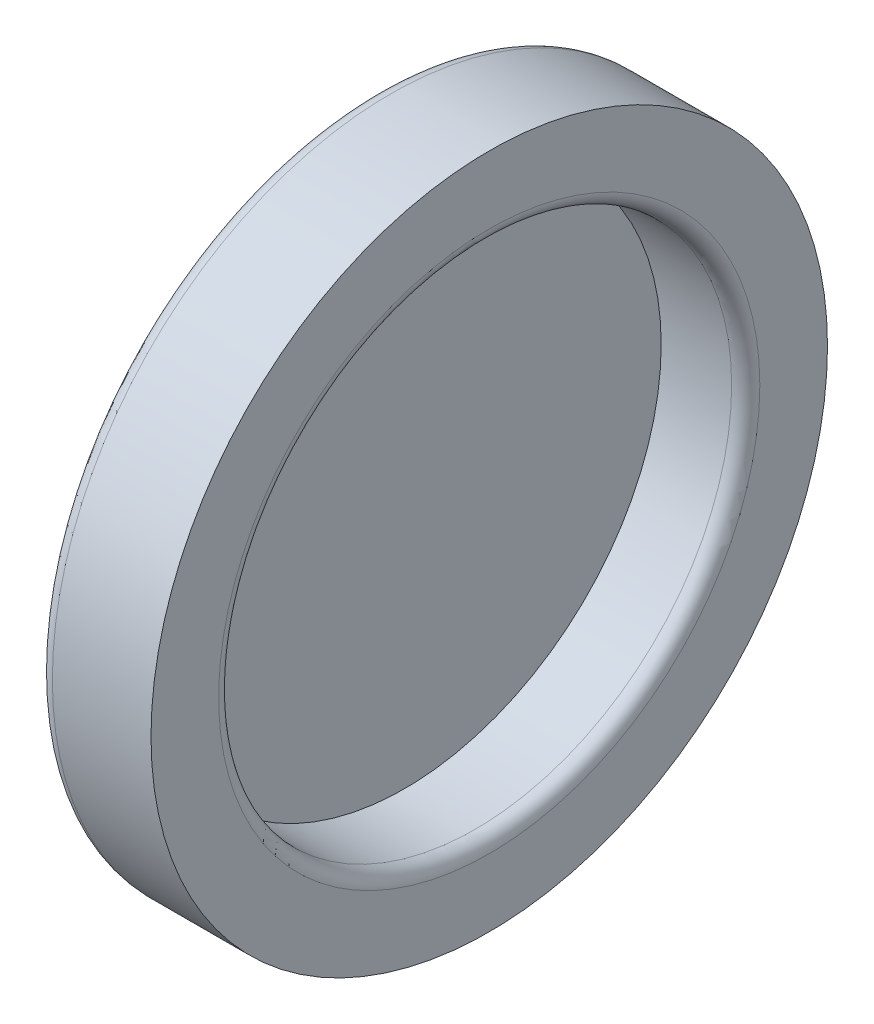
ISO-10303-21;
HEADER;
FILE_DESCRIPTION(('STEP AP214'),'2;1');
FILE_NAME('part.step','',(''),(''),'','','');
FILE_SCHEMA(('AUTOMOTIVE_DESIGN { 1 0 10303 214 1 1 1 1 }'));
ENDSEC;
DATA;
#1=APPLICATION_CONTEXT('core data for automotive mechanical design processes');
#2=APPLICATION_PROTOCOL_DEFINITION('international standard','automotive_design',2000,#1);
#3=PRODUCT_CONTEXT('',#1,'mechanical');
#4=PRODUCT('Part','Part','',(#3));
#5=PRODUCT_RELATED_PRODUCT_CATEGORY('part','',(#4));
#6=PRODUCT_DEFINITION_FORMATION('','',#4);
#7=PRODUCT_DEFINITION_CONTEXT('part definition',#1,'design');
#8=PRODUCT_DEFINITION('design','',#6,#7);
#9=PRODUCT_DEFINITION_SHAPE('','',#8);
#10=(LENGTH_UNIT() NAMED_UNIT(*) SI_UNIT(.MILLI.,.METRE.));
#11=(NAMED_UNIT(*) PLANE_ANGLE_UNIT() SI_UNIT($,.RADIAN.));
#12=(NAMED_UNIT(*) SI_UNIT($,.STERADIAN.) SOLID_ANGLE_UNIT());
#13=UNCERTAINTY_MEASURE_WITH_UNIT(LENGTH_MEASURE(1.E-05),#10,'distance_accuracy_value','');
#14=(GEOMETRIC_REPRESENTATION_CONTEXT(3) GLOBAL_UNCERTAINTY_ASSIGNED_CONTEXT((#13)) GLOBAL_UNIT_ASSIGNED_CONTEXT((#10,
#11,#12)) REPRESENTATION_CONTEXT('',''));
#15=CARTESIAN_POINT('',(0.,0.,0.));
#16=DIRECTION('',(0.,0.,1.));
#17=DIRECTION('',(1.,0.,0.));
#18=AXIS2_PLACEMENT_3D('',#15,#16,#17);
#19=CARTESIAN_POINT('',(4.,0.,0.));
#20=DIRECTION('',(-1.,0.,0.));
#21=DIRECTION('',(0.,0.,1.));
#22=AXIS2_PLACEMENT_3D('',#19,#20,#21);
#23=CYLINDRICAL_SURFACE('',#22,12.);
#24=CARTESIAN_POINT('',(0.5,0.,0.));
#25=DIRECTION('',(1.,0.,0.));
#26=DIRECTION('',(0.,0.,-1.));
#27=AXIS2_PLACEMENT_3D('',#24,#25,#26);
#28=CIRCLE('',#27,12.);
#29=CARTESIAN_POINT('',(0.5,0.,-12.));
#30=VERTEX_POINT('',#29);
#31=EDGE_CURVE('E46',#30,#30,#28,.T.);
#32=ORIENTED_EDGE('',*,*,#31,.T.);
#33=EDGE_LOOP('',(#32));
#34=FACE_BOUND('',#33,.T.);
#35=CARTESIAN_POINT('',(4.,0.,0.));
#36=DIRECTION('',(1.,0.,0.));
#37=DIRECTION('',(0.,0.,-1.));
#38=AXIS2_PLACEMENT_3D('',#35,#36,#37);
#39=CIRCLE('',#38,12.);
#40=CARTESIAN_POINT('',(4.,0.,-12.));
#41=VERTEX_POINT('',#40);
#42=EDGE_CURVE('E59',#41,#41,#39,.T.);
#43=ORIENTED_EDGE('',*,*,#42,.F.);
#44=EDGE_LOOP('',(#43));
#45=FACE_BOUND('',#44,.T.);
#46=ADVANCED_FACE('F39',(#34,#45),#23,.T.);
#47=CARTESIAN_POINT('',(4.,0.,0.));
#48=DIRECTION('',(1.,0.,0.));
#49=DIRECTION('',(0.,0.,-1.));
#50=AXIS2_PLACEMENT_3D('',#47,#48,#49);
#51=PLANE('',#50);
#52=CARTESIAN_POINT('',(4.,0.,0.));
#53=DIRECTION('',(1.,0.,0.));
#54=DIRECTION('',(0.,0.,-1.));
#55=AXIS2_PLACEMENT_3D('',#52,#53,#54);
#56=CIRCLE('',#55,9.6);
#57=CARTESIAN_POINT('',(4.,0.,-9.6));
#58=VERTEX_POINT('',#57);
#59=EDGE_CURVE('E50',#58,#58,#56,.F.);
#60=ORIENTED_EDGE('',*,*,#59,.T.);
#61=EDGE_LOOP('',(#60));
#62=FACE_BOUND('',#61,.T.);
#63=ORIENTED_EDGE('',*,*,#42,.T.);
#64=EDGE_LOOP('',(#63));
#65=FACE_BOUND('',#64,.T.);
#66=ADVANCED_FACE('F79',(#62,#65),#51,.T.);
#67=CARTESIAN_POINT('',(0.,0.,0.));
#68=DIRECTION('',(1.,0.,0.));
#69=DIRECTION('',(0.,0.,-1.));
#70=AXIS2_PLACEMENT_3D('',#67,#68,#69);
#71=PLANE('',#70);
#72=CARTESIAN_POINT('',(0.,0.,0.));
#73=DIRECTION('',(1.,0.,0.));
#74=DIRECTION('',(0.,0.,-1.));
#75=AXIS2_PLACEMENT_3D('',#72,#73,#74);
#76=CIRCLE('',#75,11.5);
#77=CARTESIAN_POINT('',(0.,0.,-11.5));
#78=VERTEX_POINT('',#77);
#79=EDGE_CURVE('E10',#78,#78,#76,.F.);
#80=ORIENTED_EDGE('',*,*,#79,.T.);
#81=EDGE_LOOP('',(#80));
#82=FACE_BOUND('',#81,.T.);
#83=ADVANCED_FACE('F70',(#82),#71,.F.);
#84=CARTESIAN_POINT('',(1.,0.,0.));
#85=DIRECTION('',(1.,0.,0.));
#86=DIRECTION('',(0.,0.,-1.));
#87=AXIS2_PLACEMENT_3D('',#84,#85,#86);
#88=CYLINDRICAL_SURFACE('',#87,9.1);
#89=CARTESIAN_POINT('',(3.5,0.,0.));
#90=DIRECTION('',(1.,0.,0.));
#91=DIRECTION('',(0.,0.,-1.));
#92=AXIS2_PLACEMENT_3D('',#89,#90,#91);
#93=CIRCLE('',#92,9.1);
#94=CARTESIAN_POINT('',(3.5,0.,-9.1));
#95=VERTEX_POINT('',#94);
#96=EDGE_CURVE('E54',#95,#95,#93,.T.);
#97=ORIENTED_EDGE('',*,*,#96,.T.);
#98=EDGE_LOOP('',(#97));
#99=FACE_BOUND('',#98,.T.);
#100=CARTESIAN_POINT('',(1.,0.,0.));
#101=DIRECTION('',(1.,0.,0.));
#102=DIRECTION('',(0.,0.,-1.));
#103=AXIS2_PLACEMENT_3D('',#100,#101,#102);
#104=CIRCLE('',#103,9.1);
#105=CARTESIAN_POINT('',(1.,0.,-9.1));
#106=VERTEX_POINT('',#105);
#107=EDGE_CURVE('E62',#106,#106,#104,.T.);
#108=ORIENTED_EDGE('',*,*,#107,.F.);
#109=EDGE_LOOP('',(#108));
#110=FACE_BOUND('',#109,.T.);
#111=ADVANCED_FACE('F68',(#99,#110),#88,.F.);
#112=CARTESIAN_POINT('',(1.,0.,0.));
#113=DIRECTION('',(1.,0.,0.));
#114=DIRECTION('',(0.,0.,-1.));
#115=AXIS2_PLACEMENT_3D('',#112,#113,#114);
#116=PLANE('',#115);
#117=ORIENTED_EDGE('',*,*,#107,.T.);
#118=EDGE_LOOP('',(#117));
#119=FACE_BOUND('',#118,.T.);
#120=ADVANCED_FACE('F66',(#119),#116,.T.);
#121=CARTESIAN_POINT('',(3.5,0.,0.));
#122=DIRECTION('',(1.,0.,0.));
#123=DIRECTION('',(0.,0.,-1.));
#124=AXIS2_PLACEMENT_3D('',#121,#122,#123);
#125=TOROIDAL_SURFACE('',#124,9.6,0.5);
#126=ORIENTED_EDGE('',*,*,#59,.F.);
#127=EDGE_LOOP('',(#126));
#128=FACE_BOUND('',#127,.T.);
#129=ORIENTED_EDGE('',*,*,#96,.F.);
#130=EDGE_LOOP('',(#129));
#131=FACE_BOUND('',#130,.T.);
#132=ADVANCED_FACE('F77',(#128,#131),#125,.T.);
#133=CARTESIAN_POINT('',(0.5,0.,0.));
#134=DIRECTION('',(1.,0.,0.));
#135=DIRECTION('',(0.,0.,-1.));
#136=AXIS2_PLACEMENT_3D('',#133,#134,#135);
#137=TOROIDAL_SURFACE('',#136,11.5,0.5);
#138=ORIENTED_EDGE('',*,*,#79,.F.);
#139=EDGE_LOOP('',(#138));
#140=FACE_BOUND('',#139,.T.);
#141=ORIENTED_EDGE('',*,*,#31,.F.);
#142=EDGE_LOOP('',(#141));
#143=FACE_BOUND('',#142,.T.);
#144=ADVANCED_FACE('F41',(#140,#143),#137,.T.);
#145=CLOSED_SHELL('',(#46,#66,#83,#111,#120,#132,#144));
#146=MANIFOLD_SOLID_BREP('B2',#145);
#147=ADVANCED_BREP_SHAPE_REPRESENTATION('',(#18,#146),#14);
#148=SHAPE_DEFINITION_REPRESENTATION(#9,#147);
ENDSEC;
END-ISO-10303-21;
